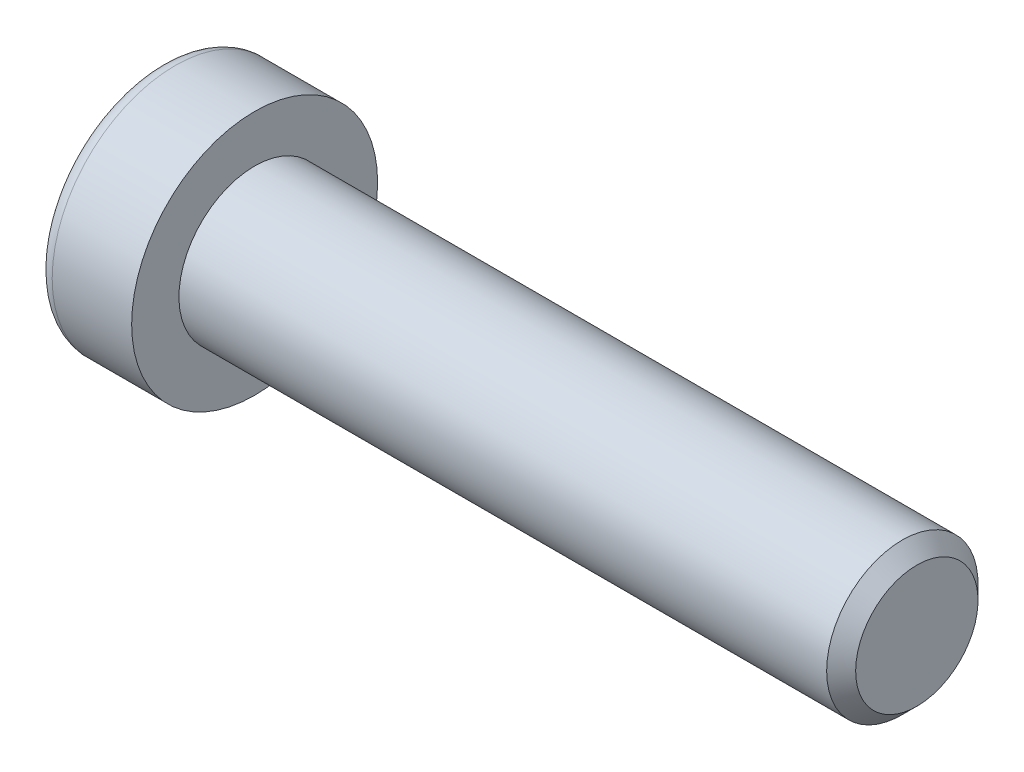
ISO-10303-21;
HEADER;
FILE_DESCRIPTION(('STEP AP214'),'2;1');
FILE_NAME('part.step','',(''),(''),'','','');
FILE_SCHEMA(('AUTOMOTIVE_DESIGN { 1 0 10303 214 1 1 1 1 }'));
ENDSEC;
DATA;
#1=APPLICATION_CONTEXT('core data for automotive mechanical design processes');
#2=APPLICATION_PROTOCOL_DEFINITION('international standard','automotive_design',2000,#1);
#3=PRODUCT_CONTEXT('',#1,'mechanical');
#4=PRODUCT('Part','Part','',(#3));
#5=PRODUCT_RELATED_PRODUCT_CATEGORY('part','',(#4));
#6=PRODUCT_DEFINITION_FORMATION('','',#4);
#7=PRODUCT_DEFINITION_CONTEXT('part definition',#1,'design');
#8=PRODUCT_DEFINITION('design','',#6,#7);
#9=PRODUCT_DEFINITION_SHAPE('','',#8);
#10=(LENGTH_UNIT() NAMED_UNIT(*) SI_UNIT(.MILLI.,.METRE.));
#11=(NAMED_UNIT(*) PLANE_ANGLE_UNIT() SI_UNIT($,.RADIAN.));
#12=(NAMED_UNIT(*) SI_UNIT($,.STERADIAN.) SOLID_ANGLE_UNIT());
#13=UNCERTAINTY_MEASURE_WITH_UNIT(LENGTH_MEASURE(1.E-05),#10,'distance_accuracy_value','');
#14=(GEOMETRIC_REPRESENTATION_CONTEXT(3) GLOBAL_UNCERTAINTY_ASSIGNED_CONTEXT((#13)) GLOBAL_UNIT_ASSIGNED_CONTEXT((#10,
#11,#12)) REPRESENTATION_CONTEXT('',''));
#15=CARTESIAN_POINT('',(0.,0.,0.));
#16=DIRECTION('',(0.,0.,1.));
#17=DIRECTION('',(1.,0.,0.));
#18=AXIS2_PLACEMENT_3D('',#15,#16,#17);
#19=CARTESIAN_POINT('',(-1.21000000177673,0.,0.));
#20=DIRECTION('',(-1.,0.,0.));
#21=DIRECTION('',(0.,0.,1.));
#22=AXIS2_PLACEMENT_3D('',#19,#20,#21);
#23=CONICAL_SURFACE('',#22,2.9040718530382,1.04719754996794);
#24=CARTESIAN_POINT('',(0.466666669012739,-1.13686837721616E-10,0.));
#25=VERTEX_POINT('',#24);
#26=VERTEX_LOOP('',#25);
#27=FACE_BOUND('',#26,.T.);
#28=CARTESIAN_POINT('',(-1.20000000188032,2.50000000042828,1.44337567243126));
#29=CARTESIAN_POINT('',(-1.16336943336427,2.50000000015382,1.31652043353318));
#30=CARTESIAN_POINT('',(-1.13005584831707,2.50000000004123,1.18857018203745));
#31=CARTESIAN_POINT('',(-1.07190798610144,2.49999999995868,0.930454306037677));
#32=CARTESIAN_POINT('',(-1.04709427719735,2.49999999998906,0.800284096806924));
#33=CARTESIAN_POINT('',(-1.00846995036617,2.50000000001067,0.541556812494233));
#34=CARTESIAN_POINT('',(-0.994402236162447,2.50000000000284,0.413039534770439));
#35=CARTESIAN_POINT('',(-0.977611461824864,2.49999999999716,0.155400578562858));
#36=CARTESIAN_POINT('',(-0.974874494142074,2.49999999999929,0.0262798358840899));
#37=CARTESIAN_POINT('',(-0.980582864422355,2.50000000000062,-0.21496841995549));
#38=CARTESIAN_POINT('',(-0.987626608278002,2.50000000000017,-0.327132134383147));
#39=CARTESIAN_POINT('',(-1.00994662771906,2.49999999999983,-0.550728853222557));
#40=CARTESIAN_POINT('',(-1.02523052031715,2.49999999999995,-0.66216108485018));
#41=CARTESIAN_POINT('',(-1.06343729360609,2.50000000000005,-0.886218434015897));
#42=CARTESIAN_POINT('',(-1.08652205474861,2.50000000000003,-0.998815208377872));
#43=CARTESIAN_POINT('',(-1.13891470311393,2.49999999999998,-1.2223298619213));
#44=CARTESIAN_POINT('',(-1.16821028805135,2.49999999999995,-1.33325060237494));
#45=CARTESIAN_POINT('',(-1.20000000215881,2.5,-1.44337567242466));
#46=B_SPLINE_CURVE_WITH_KNOTS('',3,(#28,#29,#30,#31,#32,#33,#34,#35,#36,#37,#38,#39,#40,#41,#42,
#43,#44,#45),.UNSPECIFIED.,.F.,.F.,(4,2,2,2,2,2,2,2,4),(0.,0.396270014515872,0.793492271437725,
1.18088450788727,1.56780111135406,1.90463472821334,2.24178024186127,2.58640202744164,
2.93034746593166),.UNSPECIFIED.);
#47=CARTESIAN_POINT('',(-1.20000000213914,2.49999999973261,1.44337567281968));
#48=VERTEX_POINT('',#47);
#49=CARTESIAN_POINT('',(-1.20000000222827,2.5,-1.44337567266531));
#50=VERTEX_POINT('',#49);
#51=EDGE_CURVE('E20',#48,#50,#46,.T.);
#52=ORIENTED_EDGE('',*,*,#51,.T.);
#53=CARTESIAN_POINT('',(-1.20000000188032,2.49999999974405,-1.44337567361636));
#54=CARTESIAN_POINT('',(-1.16336943336427,2.39014014011794,-1.50680329282772));
#55=CARTESIAN_POINT('',(-1.13005584831707,2.27933197184574,-1.57077841847808));
#56=CARTESIAN_POINT('',(-1.07190798610144,2.05579706606859,-1.69983635640647));
#57=CARTESIAN_POINT('',(-1.04709427719735,1.94306635807401,-1.76492146104816));
#58=CARTESIAN_POINT('',(-1.00846995036617,1.71900195721787,-1.89428510322322));
#59=CARTESIAN_POINT('',(-0.994402236162446,1.60770272987993,-1.95854374207834));
#60=CARTESIAN_POINT('',(-0.977611461824863,1.38458084879682,-2.08736322017721));
#61=CARTESIAN_POINT('',(-0.974874494142074,1.27275900548255,-2.15192359151843));
#62=CARTESIAN_POINT('',(-0.980582864422354,1.06383188730746,-2.27254771943938));
#63=CARTESIAN_POINT('',(-0.987626608278001,0.966695261230055,-2.32862957665281));
#64=CARTESIAN_POINT('',(-1.00994662771905,0.773054822512112,-2.44042793607223));
#65=CARTESIAN_POINT('',(-1.02523052031715,0.676551679122258,-2.49614405188614));
#66=CARTESIAN_POINT('',(-1.06343729360609,0.482512322840195,-2.60817272646909));
#67=CARTESIAN_POINT('',(-1.08652205474861,0.385000655858529,-2.66447111365005));
#68=CARTESIAN_POINT('',(-1.13891470311393,0.191431287771819,-2.77622844042172));
#69=CARTESIAN_POINT('',(-1.16821028805135,0.09537110873237,-2.83168881064853));
#70=CARTESIAN_POINT('',(-1.20000000215881,4.75795613603965E-10,-2.88675134567343));
#71=B_SPLINE_CURVE_WITH_KNOTS('',3,(#53,#54,#55,#56,#57,#58,#59,#60,#61,#62,#63,#64,#65,#66,#67,
#68,#69,#70),.UNSPECIFIED.,.F.,.F.,(4,2,2,2,2,2,2,2,4),(0.,0.396270014515872,0.793492271437724,
1.18088450788727,1.56780111135406,1.90463472821334,2.24178024186127,2.58640202744164,
2.93034746593166),.UNSPECIFIED.);
#72=CARTESIAN_POINT('',(-1.20000000213914,0.,-2.88675134563937));
#73=VERTEX_POINT('',#72);
#74=EDGE_CURVE('E81',#50,#73,#71,.T.);
#75=ORIENTED_EDGE('',*,*,#74,.T.);
#76=CARTESIAN_POINT('',(-1.20000000188032,-6.84219602411263E-10,-2.88675134604762));
#77=CARTESIAN_POINT('',(-1.16336943336427,-0.109859860035873,-2.8233237263609));
#78=CARTESIAN_POINT('',(-1.13005584831707,-0.220668028195489,-2.75934860051552));
#79=CARTESIAN_POINT('',(-1.07190798610144,-0.444202933890087,-2.63029066244415));
#80=CARTESIAN_POINT('',(-1.04709427719735,-0.556933641915047,-2.56520555785509));
#81=CARTESIAN_POINT('',(-1.00846995036617,-0.780998042792801,-2.43584191571745));
#82=CARTESIAN_POINT('',(-0.994402236162447,-0.892297270122914,-2.37158327684878));
#83=CARTESIAN_POINT('',(-0.977611461824864,-1.11541915120034,-2.24276379874007));
#84=CARTESIAN_POINT('',(-0.974874494142073,-1.22724099451673,-2.17820342740253));
#85=CARTESIAN_POINT('',(-0.980582864422354,-1.43616811269316,-2.05757929948389));
#86=CARTESIAN_POINT('',(-0.987626608278001,-1.53330473877011,-2.00149744226967));
#87=CARTESIAN_POINT('',(-1.00994662771906,-1.72694517748772,-1.88969908284967));
#88=CARTESIAN_POINT('',(-1.02523052031715,-1.82344832087769,-1.83398296703597));
#89=CARTESIAN_POINT('',(-1.06343729360609,-2.01748767715985,-1.72195429245319));
#90=CARTESIAN_POINT('',(-1.08652205474861,-2.1149993441415,-1.66565590527218));
#91=CARTESIAN_POINT('',(-1.13891470311393,-2.30856871222816,-1.55389857850043));
#92=CARTESIAN_POINT('',(-1.16821028805135,-2.40462889126758,-1.49843820827358));
#93=CARTESIAN_POINT('',(-1.20000000215881,-2.49999999952421,-1.44337567324877));
#94=B_SPLINE_CURVE_WITH_KNOTS('',3,(#76,#77,#78,#79,#80,#81,#82,#83,#84,#85,#86,#87,#88,#89,#90,
#91,#92,#93),.UNSPECIFIED.,.F.,.F.,(4,2,2,2,2,2,2,2,4),(0.,0.396270014515872,0.793492271437725,
1.18088450788727,1.56780111135406,1.90463472821334,2.24178024186127,2.58640202744164,
2.93034746593167),.UNSPECIFIED.);
#95=CARTESIAN_POINT('',(-1.20000000213914,-2.49999999973261,-1.44337567281968));
#96=VERTEX_POINT('',#95);
#97=EDGE_CURVE('E107',#73,#96,#94,.T.);
#98=ORIENTED_EDGE('',*,*,#97,.T.);
#99=CARTESIAN_POINT('',(-1.20000000188032,-2.50000000042828,-1.44337567243126));
#100=CARTESIAN_POINT('',(-1.16336943336427,-2.50000000015382,-1.31652043353318));
#101=CARTESIAN_POINT('',(-1.13005584831707,-2.50000000004123,-1.18857018203745));
#102=CARTESIAN_POINT('',(-1.07190798610144,-2.49999999995868,-0.93045430603768));
#103=CARTESIAN_POINT('',(-1.04709427719735,-2.49999999998906,-0.800284096806928));
#104=CARTESIAN_POINT('',(-1.00846995036617,-2.50000000001067,-0.541556812494236));
#105=CARTESIAN_POINT('',(-0.994402236162447,-2.50000000000284,-0.413039534770443));
#106=CARTESIAN_POINT('',(-0.977611461824863,-2.49999999999716,-0.155400578562862));
#107=CARTESIAN_POINT('',(-0.974874494142073,-2.49999999999929,-0.0262798358840941));
#108=CARTESIAN_POINT('',(-0.980582864422354,-2.50000000000062,0.214968419955486));
#109=CARTESIAN_POINT('',(-0.987626608278001,-2.50000000000017,0.327132134383144));
#110=CARTESIAN_POINT('',(-1.00994662771905,-2.49999999999983,0.550728853222554));
#111=CARTESIAN_POINT('',(-1.02523052031715,-2.49999999999995,0.662161084850177));
#112=CARTESIAN_POINT('',(-1.06343729360609,-2.50000000000005,0.886218434015895));
#113=CARTESIAN_POINT('',(-1.08652205474861,-2.50000000000002,0.99881520837787));
#114=CARTESIAN_POINT('',(-1.13891470311393,-2.49999999999998,1.2223298619213));
#115=CARTESIAN_POINT('',(-1.16821028805135,-2.49999999999995,1.33325060237494));
#116=CARTESIAN_POINT('',(-1.20000000215881,-2.5,1.44337567242466));
#117=B_SPLINE_CURVE_WITH_KNOTS('',3,(#99,#100,#101,#102,#103,#104,#105,#106,#107,#108,#109,#110,
#111,#112,#113,#114,#115,#116),.UNSPECIFIED.,.F.,.F.,(4,2,2,2,2,2,2,2,4),(0.,0.396270014515872,
0.793492271437724,1.18088450788727,1.56780111135406,1.90463472821334,2.24178024186127,
2.58640202744164,2.93034746593167),.UNSPECIFIED.);
#118=CARTESIAN_POINT('',(-1.20000000213914,-2.49999999973261,1.44337567281969));
#119=VERTEX_POINT('',#118);
#120=EDGE_CURVE('E132',#96,#119,#117,.T.);
#121=ORIENTED_EDGE('',*,*,#120,.T.);
#122=CARTESIAN_POINT('',(-1.20000000188032,-2.49999999974406,1.44337567361636));
#123=CARTESIAN_POINT('',(-1.16336943336427,-2.39014014011795,1.50680329282772));
#124=CARTESIAN_POINT('',(-1.13005584831707,-2.27933197184574,1.57077841847807));
#125=CARTESIAN_POINT('',(-1.07190798610144,-2.05579706606859,1.69983635640647));
#126=CARTESIAN_POINT('',(-1.04709427719735,-1.94306635807401,1.76492146104816));
#127=CARTESIAN_POINT('',(-1.00846995036617,-1.71900195721787,1.89428510322322));
#128=CARTESIAN_POINT('',(-0.994402236162447,-1.60770272987993,1.95854374207834));
#129=CARTESIAN_POINT('',(-0.977611461824864,-1.38458084879682,2.08736322017721));
#130=CARTESIAN_POINT('',(-0.974874494142074,-1.27275900548255,2.15192359151843));
#131=CARTESIAN_POINT('',(-0.980582864422354,-1.06383188730746,2.27254771943938));
#132=CARTESIAN_POINT('',(-0.987626608278001,-0.966695261230056,2.32862957665281));
#133=CARTESIAN_POINT('',(-1.00994662771905,-0.773054822512113,2.44042793607223));
#134=CARTESIAN_POINT('',(-1.02523052031715,-0.676551679122259,2.49614405188614));
#135=CARTESIAN_POINT('',(-1.06343729360609,-0.482512322840196,2.60817272646909));
#136=CARTESIAN_POINT('',(-1.08652205474861,-0.385000655858529,2.66447111365005));
#137=CARTESIAN_POINT('',(-1.13891470311393,-0.19143128777182,2.77622844042172));
#138=CARTESIAN_POINT('',(-1.16821028805135,-0.0953711087323703,2.83168881064852));
#139=CARTESIAN_POINT('',(-1.20000000215881,-4.75795563263291E-10,2.88675134567343));
#140=B_SPLINE_CURVE_WITH_KNOTS('',3,(#122,#123,#124,#125,#126,#127,#128,#129,#130,#131,#132,
#133,#134,#135,#136,#137,#138,#139),.UNSPECIFIED.,.F.,.F.,(4,2,2,2,2,2,2,2,4),(0.,
0.396270014515872,0.793492271437724,1.18088450788727,1.56780111135406,1.90463472821334,
2.24178024186127,2.58640202744164,2.93034746593167),.UNSPECIFIED.);
#141=CARTESIAN_POINT('',(-1.20000000213914,0.,2.88675134563937));
#142=VERTEX_POINT('',#141);
#143=EDGE_CURVE('E141',#119,#142,#140,.T.);
#144=ORIENTED_EDGE('',*,*,#143,.T.);
#145=CARTESIAN_POINT('',(-1.20000000188032,6.84218568363619E-10,2.88675134604763));
#146=CARTESIAN_POINT('',(-1.16336943336427,0.109859860035872,2.8233237263609));
#147=CARTESIAN_POINT('',(-1.13005584831707,0.220668028195487,2.75934860051552));
#148=CARTESIAN_POINT('',(-1.07190798610144,0.444202933890086,2.63029066244415));
#149=CARTESIAN_POINT('',(-1.04709427719735,0.556933641915045,2.56520555785509));
#150=CARTESIAN_POINT('',(-1.00846995036617,0.7809980427928,2.43584191571745));
#151=CARTESIAN_POINT('',(-0.994402236162446,0.892297270122912,2.37158327684878));
#152=CARTESIAN_POINT('',(-0.977611461824863,1.11541915120034,2.24276379874007));
#153=CARTESIAN_POINT('',(-0.974874494142073,1.22724099451673,2.17820342740253));
#154=CARTESIAN_POINT('',(-0.980582864422353,1.43616811269316,2.05757929948389));
#155=CARTESIAN_POINT('',(-0.987626608278,1.53330473877011,2.00149744226967));
#156=CARTESIAN_POINT('',(-1.00994662771905,1.72694517748772,1.88969908284967));
#157=CARTESIAN_POINT('',(-1.02523052031715,1.82344832087769,1.83398296703596));
#158=CARTESIAN_POINT('',(-1.06343729360609,2.01748767715985,1.72195429245319));
#159=CARTESIAN_POINT('',(-1.08652205474861,2.1149993441415,1.66565590527218));
#160=CARTESIAN_POINT('',(-1.13891470311393,2.30856871222816,1.55389857850042));
#161=CARTESIAN_POINT('',(-1.16821028805135,2.40462889126758,1.49843820827358));
#162=CARTESIAN_POINT('',(-1.2000000021588,2.49999999952421,1.44337567324876));
#163=B_SPLINE_CURVE_WITH_KNOTS('',3,(#145,#146,#147,#148,#149,#150,#151,#152,#153,#154,#155,
#156,#157,#158,#159,#160,#161,#162),.UNSPECIFIED.,.F.,.F.,(4,2,2,2,2,2,2,2,4),(0.,
0.396270014515872,0.793492271437725,1.18088450788727,1.56780111135406,1.90463472821334,
2.24178024186127,2.58640202744164,2.93034746593167),.UNSPECIFIED.);
#164=EDGE_CURVE('E83',#142,#48,#163,.T.);
#165=ORIENTED_EDGE('',*,*,#164,.T.);
#166=EDGE_LOOP('',(#52,#75,#98,#121,#144,#165));
#167=FACE_BOUND('',#166,.T.);
#168=ADVANCED_FACE('F16',(#27,#167),#23,.F.);
#169=CARTESIAN_POINT('',(-5.,2.5,1.44337567297406));
#170=DIRECTION('',(0.,1.,0.));
#171=DIRECTION('',(0.,0.,1.));
#172=AXIS2_PLACEMENT_3D('',#169,#170,#171);
#173=PLANE('',#172);
#174=DIRECTION('',(1.,0.,0.));
#175=VECTOR('',#174,1.);
#176=CARTESIAN_POINT('',(-5.,2.5,1.44337567297406));
#177=LINE('',#176,#175);
#178=CARTESIAN_POINT('',(-5.,2.5,1.44337567297406));
#179=VERTEX_POINT('',#178);
#180=EDGE_CURVE('E85',#48,#179,#177,.F.);
#181=ORIENTED_EDGE('',*,*,#180,.T.);
#182=DIRECTION('',(0.,0.,1.));
#183=VECTOR('',#182,1.);
#184=CARTESIAN_POINT('',(-5.,2.5,0.));
#185=LINE('',#184,#183);
#186=CARTESIAN_POINT('',(-5.,2.5,-1.44337567297407));
#187=VERTEX_POINT('',#186);
#188=EDGE_CURVE('E90',#187,#179,#185,.T.);
#189=ORIENTED_EDGE('',*,*,#188,.F.);
#190=DIRECTION('',(1.,0.,0.));
#191=VECTOR('',#190,1.);
#192=CARTESIAN_POINT('',(-5.,2.5,-1.44337567297407));
#193=LINE('',#192,#191);
#194=EDGE_CURVE('E88',#187,#50,#193,.T.);
#195=ORIENTED_EDGE('',*,*,#194,.T.);
#196=ORIENTED_EDGE('',*,*,#51,.F.);
#197=EDGE_LOOP('',(#181,#189,#195,#196));
#198=FACE_BOUND('',#197,.T.);
#199=ADVANCED_FACE('F77',(#198),#173,.F.);
#200=CARTESIAN_POINT('',(-5.,0.,2.88675134594813));
#201=DIRECTION('',(0.,0.500000000000001,0.866025403784438));
#202=DIRECTION('',(0.,-0.866025403784438,0.500000000000001));
#203=AXIS2_PLACEMENT_3D('',#200,#201,#202);
#204=PLANE('',#203);
#205=DIRECTION('',(1.,0.,0.));
#206=VECTOR('',#205,1.);
#207=CARTESIAN_POINT('',(-5.,0.,2.88675134594813));
#208=LINE('',#207,#206);
#209=CARTESIAN_POINT('',(-5.,0.,2.88675134594813));
#210=VERTEX_POINT('',#209);
#211=EDGE_CURVE('E146',#142,#210,#208,.F.);
#212=ORIENTED_EDGE('',*,*,#211,.T.);
#213=DIRECTION('',(0.,-0.866025403784438,0.500000000000001));
#214=VECTOR('',#213,1.);
#215=CARTESIAN_POINT('',(-5.,2.5,1.44337567297406));
#216=LINE('',#215,#214);
#217=EDGE_CURVE('E96',#179,#210,#216,.T.);
#218=ORIENTED_EDGE('',*,*,#217,.F.);
#219=ORIENTED_EDGE('',*,*,#180,.F.);
#220=ORIENTED_EDGE('',*,*,#164,.F.);
#221=EDGE_LOOP('',(#212,#218,#219,#220));
#222=FACE_BOUND('',#221,.T.);
#223=ADVANCED_FACE('F151',(#222),#204,.F.);
#224=CARTESIAN_POINT('',(-5.,-2.5,1.44337567297406));
#225=DIRECTION('',(0.,-0.5,0.866025403784439));
#226=DIRECTION('',(0.,-0.866025403784439,-0.5));
#227=AXIS2_PLACEMENT_3D('',#224,#225,#226);
#228=PLANE('',#227);
#229=DIRECTION('',(1.,0.,0.));
#230=VECTOR('',#229,1.);
#231=CARTESIAN_POINT('',(-5.,-2.5,1.44337567297406));
#232=LINE('',#231,#230);
#233=CARTESIAN_POINT('',(-5.,-2.5,1.44337567297406));
#234=VERTEX_POINT('',#233);
#235=EDGE_CURVE('E140',#119,#234,#232,.F.);
#236=ORIENTED_EDGE('',*,*,#235,.T.);
#237=DIRECTION('',(0.,-0.866025403784439,-0.5));
#238=VECTOR('',#237,1.);
#239=CARTESIAN_POINT('',(-5.,0.,2.88675134594813));
#240=LINE('',#239,#238);
#241=EDGE_CURVE('E229',#210,#234,#240,.T.);
#242=ORIENTED_EDGE('',*,*,#241,.F.);
#243=ORIENTED_EDGE('',*,*,#211,.F.);
#244=ORIENTED_EDGE('',*,*,#143,.F.);
#245=EDGE_LOOP('',(#236,#242,#243,#244));
#246=FACE_BOUND('',#245,.T.);
#247=ADVANCED_FACE('F128',(#246),#228,.F.);
#248=CARTESIAN_POINT('',(-5.,-2.5,-1.44337567297406));
#249=DIRECTION('',(0.,-1.,0.));
#250=DIRECTION('',(0.,0.,-1.));
#251=AXIS2_PLACEMENT_3D('',#248,#249,#250);
#252=PLANE('',#251);
#253=DIRECTION('',(1.,0.,0.));
#254=VECTOR('',#253,1.);
#255=CARTESIAN_POINT('',(-5.,-2.5,-1.44337567297406));
#256=LINE('',#255,#254);
#257=CARTESIAN_POINT('',(-5.,-2.5,-1.44337567297406));
#258=VERTEX_POINT('',#257);
#259=EDGE_CURVE('E139',#96,#258,#256,.F.);
#260=ORIENTED_EDGE('',*,*,#259,.T.);
#261=DIRECTION('',(0.,0.,1.));
#262=VECTOR('',#261,1.);
#263=CARTESIAN_POINT('',(-5.,-2.5,0.));
#264=LINE('',#263,#262);
#265=EDGE_CURVE('E226',#234,#258,#264,.F.);
#266=ORIENTED_EDGE('',*,*,#265,.F.);
#267=ORIENTED_EDGE('',*,*,#235,.F.);
#268=ORIENTED_EDGE('',*,*,#120,.F.);
#269=EDGE_LOOP('',(#260,#266,#267,#268));
#270=FACE_BOUND('',#269,.T.);
#271=ADVANCED_FACE('F124',(#270),#252,.F.);
#272=CARTESIAN_POINT('',(-5.,0.,-2.88675134594813));
#273=DIRECTION('',(0.,-0.5,-0.866025403784439));
#274=DIRECTION('',(0.,0.866025403784439,-0.5));
#275=AXIS2_PLACEMENT_3D('',#272,#273,#274);
#276=PLANE('',#275);
#277=DIRECTION('',(1.,0.,0.));
#278=VECTOR('',#277,1.);
#279=CARTESIAN_POINT('',(-5.,0.,-2.88675134594813));
#280=LINE('',#279,#278);
#281=CARTESIAN_POINT('',(-5.,0.,-2.88675134594813));
#282=VERTEX_POINT('',#281);
#283=EDGE_CURVE('E39',#73,#282,#280,.F.);
#284=ORIENTED_EDGE('',*,*,#283,.T.);
#285=DIRECTION('',(0.,0.866025403784438,-0.500000000000001));
#286=VECTOR('',#285,1.);
#287=CARTESIAN_POINT('',(-5.,-2.5,-1.44337567297406));
#288=LINE('',#287,#286);
#289=EDGE_CURVE('E223',#258,#282,#288,.T.);
#290=ORIENTED_EDGE('',*,*,#289,.F.);
#291=ORIENTED_EDGE('',*,*,#259,.F.);
#292=ORIENTED_EDGE('',*,*,#97,.F.);
#293=EDGE_LOOP('',(#284,#290,#291,#292));
#294=FACE_BOUND('',#293,.T.);
#295=ADVANCED_FACE('F118',(#294),#276,.F.);
#296=CARTESIAN_POINT('',(-5.,2.5,-1.44337567297407));
#297=DIRECTION('',(0.,0.5,-0.866025403784439));
#298=DIRECTION('',(0.,0.866025403784439,0.5));
#299=AXIS2_PLACEMENT_3D('',#296,#297,#298);
#300=PLANE('',#299);
#301=ORIENTED_EDGE('',*,*,#194,.F.);
#302=DIRECTION('',(0.,0.866025403784439,0.5));
#303=VECTOR('',#302,1.);
#304=CARTESIAN_POINT('',(-5.,0.,-2.88675134594813));
#305=LINE('',#304,#303);
#306=EDGE_CURVE('E221',#282,#187,#305,.T.);
#307=ORIENTED_EDGE('',*,*,#306,.F.);
#308=ORIENTED_EDGE('',*,*,#283,.F.);
#309=ORIENTED_EDGE('',*,*,#74,.F.);
#310=EDGE_LOOP('',(#301,#307,#308,#309));
#311=FACE_BOUND('',#310,.T.);
#312=ADVANCED_FACE('F94',(#311),#300,.F.);
#313=CARTESIAN_POINT('',(-5.,4.69337567297407,0.));
#314=DIRECTION('',(-1.,0.,0.));
#315=DIRECTION('',(0.,0.,1.));
#316=AXIS2_PLACEMENT_3D('',#313,#314,#315);
#317=PLANE('',#316);
#318=ORIENTED_EDGE('',*,*,#289,.T.);
#319=ORIENTED_EDGE('',*,*,#306,.T.);
#320=ORIENTED_EDGE('',*,*,#188,.T.);
#321=ORIENTED_EDGE('',*,*,#217,.T.);
#322=ORIENTED_EDGE('',*,*,#241,.T.);
#323=ORIENTED_EDGE('',*,*,#265,.T.);
#324=EDGE_LOOP('',(#318,#319,#320,#321,#322,#323));
#325=FACE_BOUND('',#324,.T.);
#326=CARTESIAN_POINT('',(-5.,0.,0.));
#327=DIRECTION('',(1.,0.,0.));
#328=DIRECTION('',(0.,1.,0.));
#329=AXIS2_PLACEMENT_3D('',#326,#327,#328);
#330=CIRCLE('',#329,5.7);
#331=CARTESIAN_POINT('',(-5.,5.7,0.));
#332=VERTEX_POINT('',#331);
#333=EDGE_CURVE('E198',#332,#332,#330,.T.);
#334=ORIENTED_EDGE('',*,*,#333,.F.);
#335=EDGE_LOOP('',(#334));
#336=FACE_BOUND('',#335,.T.);
#337=ADVANCED_FACE('F117',(#325,#336),#317,.T.);
#338=CARTESIAN_POINT('',(-4.2,0.,0.));
#339=DIRECTION('',(1.,0.,0.));
#340=DIRECTION('',(0.,0.,-1.));
#341=AXIS2_PLACEMENT_3D('',#338,#339,#340);
#342=TOROIDAL_SURFACE('',#341,5.7,0.8);
#343=CARTESIAN_POINT('',(-4.2,0.,0.));
#344=DIRECTION('',(1.,0.,0.));
#345=DIRECTION('',(0.,1.,0.));
#346=AXIS2_PLACEMENT_3D('',#343,#344,#345);
#347=CIRCLE('',#346,6.5);
#348=CARTESIAN_POINT('',(-4.2,6.5,0.));
#349=VERTEX_POINT('',#348);
#350=EDGE_CURVE('E239',#349,#349,#347,.T.);
#351=ORIENTED_EDGE('',*,*,#350,.F.);
#352=EDGE_LOOP('',(#351));
#353=FACE_BOUND('',#352,.T.);
#354=ORIENTED_EDGE('',*,*,#333,.T.);
#355=EDGE_LOOP('',(#354));
#356=FACE_BOUND('',#355,.T.);
#357=ADVANCED_FACE('F182',(#353,#356),#342,.T.);
#358=CARTESIAN_POINT('',(-2.5,0.,0.));
#359=DIRECTION('',(1.,0.,0.));
#360=DIRECTION('',(0.,1.,0.));
#361=AXIS2_PLACEMENT_3D('',#358,#359,#360);
#362=CYLINDRICAL_SURFACE('',#361,6.5);
#363=ORIENTED_EDGE('',*,*,#350,.T.);
#364=EDGE_LOOP('',(#363));
#365=FACE_BOUND('',#364,.T.);
#366=CARTESIAN_POINT('',(0.,0.,0.));
#367=DIRECTION('',(1.,0.,0.));
#368=DIRECTION('',(0.,1.,0.));
#369=AXIS2_PLACEMENT_3D('',#366,#367,#368);
#370=CIRCLE('',#369,6.5);
#371=CARTESIAN_POINT('',(0.,6.5,0.));
#372=VERTEX_POINT('',#371);
#373=EDGE_CURVE('E105',#372,#372,#370,.T.);
#374=ORIENTED_EDGE('',*,*,#373,.F.);
#375=EDGE_LOOP('',(#374));
#376=FACE_BOUND('',#375,.T.);
#377=ADVANCED_FACE('F179',(#365,#376),#362,.T.);
#378=CARTESIAN_POINT('',(35.,2.,0.));
#379=DIRECTION('',(1.,0.,0.));
#380=DIRECTION('',(0.,0.,-1.));
#381=AXIS2_PLACEMENT_3D('',#378,#379,#380);
#382=PLANE('',#381);
#383=CARTESIAN_POINT('',(35.0000000003092,0.,0.));
#384=DIRECTION('',(-1.,0.,0.));
#385=DIRECTION('',(0.,0.,1.));
#386=AXIS2_PLACEMENT_3D('',#383,#384,#385);
#387=CIRCLE('',#386,3.23318750031376);
#388=CARTESIAN_POINT('',(35.0000000003092,0.,3.23318750031376));
#389=VERTEX_POINT('',#388);
#390=EDGE_CURVE('E235',#389,#389,#387,.T.);
#391=ORIENTED_EDGE('',*,*,#390,.F.);
#392=EDGE_LOOP('',(#391));
#393=FACE_BOUND('',#392,.T.);
#394=ADVANCED_FACE('F175',(#393),#382,.T.);
#395=CARTESIAN_POINT('',(0.,5.25,0.));
#396=DIRECTION('',(1.,0.,0.));
#397=DIRECTION('',(0.,0.,-1.));
#398=AXIS2_PLACEMENT_3D('',#395,#396,#397);
#399=PLANE('',#398);
#400=CARTESIAN_POINT('',(0.,0.,0.));
#401=DIRECTION('',(1.,0.,0.));
#402=DIRECTION('',(0.,1.,0.));
#403=AXIS2_PLACEMENT_3D('',#400,#401,#402);
#404=CIRCLE('',#403,4.);
#405=CARTESIAN_POINT('',(0.,4.,0.));
#406=VERTEX_POINT('',#405);
#407=EDGE_CURVE('E30',#406,#406,#404,.T.);
#408=ORIENTED_EDGE('',*,*,#407,.F.);
#409=EDGE_LOOP('',(#408));
#410=FACE_BOUND('',#409,.T.);
#411=ORIENTED_EDGE('',*,*,#373,.T.);
#412=EDGE_LOOP('',(#411));
#413=FACE_BOUND('',#412,.T.);
#414=ADVANCED_FACE('F168',(#410,#413),#399,.T.);
#415=CARTESIAN_POINT('',(34.2331874996944,0.,0.));
#416=DIRECTION('',(-1.,0.,0.));
#417=DIRECTION('',(0.,0.,1.));
#418=AXIS2_PLACEMENT_3D('',#415,#416,#417);
#419=CONICAL_SURFACE('',#418,3.99999999950751,0.78539816247083);
#420=ORIENTED_EDGE('',*,*,#390,.T.);
#421=EDGE_LOOP('',(#420));
#422=FACE_BOUND('',#421,.T.);
#423=CARTESIAN_POINT('',(34.2331875,0.,0.));
#424=DIRECTION('',(1.,0.,0.));
#425=DIRECTION('',(0.,1.,0.));
#426=AXIS2_PLACEMENT_3D('',#423,#424,#425);
#427=CIRCLE('',#426,4.);
#428=CARTESIAN_POINT('',(34.2331875,4.,0.));
#429=VERTEX_POINT('',#428);
#430=EDGE_CURVE('E11',#429,#429,#427,.F.);
#431=ORIENTED_EDGE('',*,*,#430,.F.);
#432=EDGE_LOOP('',(#431));
#433=FACE_BOUND('',#432,.T.);
#434=ADVANCED_FACE('F162',(#422,#433),#419,.T.);
#435=CARTESIAN_POINT('',(24.,0.,0.));
#436=DIRECTION('',(1.,0.,0.));
#437=DIRECTION('',(0.,1.,0.));
#438=AXIS2_PLACEMENT_3D('',#435,#436,#437);
#439=CYLINDRICAL_SURFACE('',#438,4.);
#440=ORIENTED_EDGE('',*,*,#430,.T.);
#441=EDGE_LOOP('',(#440));
#442=FACE_BOUND('',#441,.T.);
#443=ORIENTED_EDGE('',*,*,#407,.T.);
#444=EDGE_LOOP('',(#443));
#445=FACE_BOUND('',#444,.T.);
#446=ADVANCED_FACE('F160',(#442,#445),#439,.T.);
#447=CLOSED_SHELL('',(#168,#199,#223,#247,#271,#295,#312,#337,#357,#377,#394,#414,#434,#446));
#448=MANIFOLD_SOLID_BREP('B1',#447);
#449=ADVANCED_BREP_SHAPE_REPRESENTATION('',(#18,#448),#14);
#450=SHAPE_DEFINITION_REPRESENTATION(#9,#449);
ENDSEC;
END-ISO-10303-21;
